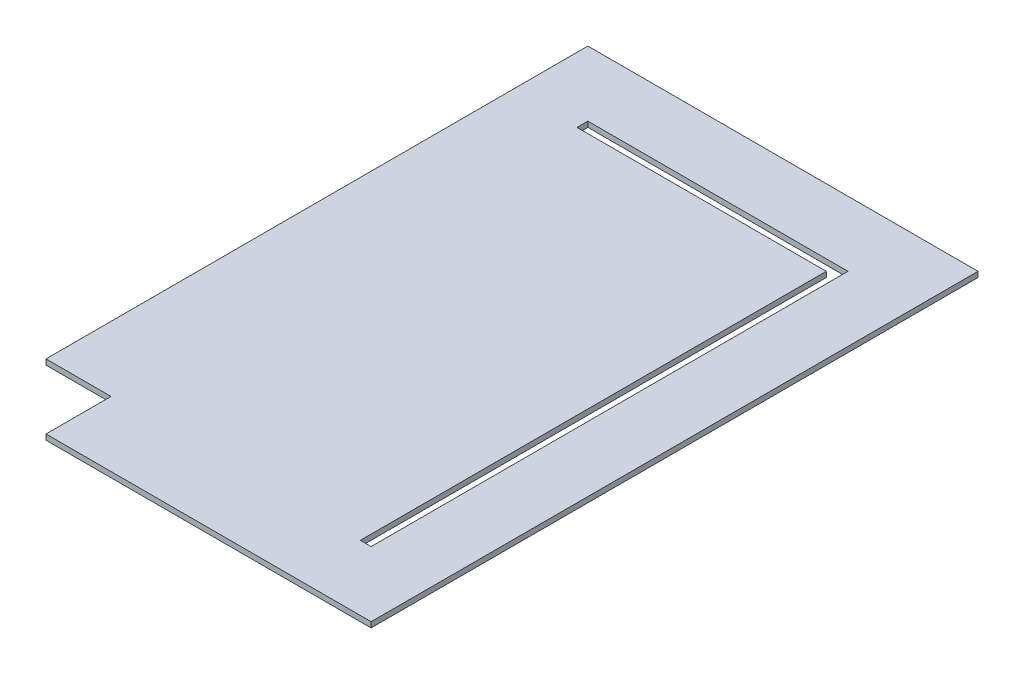
ISO-10303-21;
HEADER;
FILE_DESCRIPTION(('STEP AP214'),'2;1');
FILE_NAME('part.step','',(''),(''),'','','');
FILE_SCHEMA(('AUTOMOTIVE_DESIGN { 1 0 10303 214 1 1 1 1 }'));
ENDSEC;
DATA;
#1=APPLICATION_CONTEXT('core data for automotive mechanical design processes');
#2=APPLICATION_PROTOCOL_DEFINITION('international standard','automotive_design',2000,#1);
#3=PRODUCT_CONTEXT('',#1,'mechanical');
#4=PRODUCT('Part','Part','',(#3));
#5=PRODUCT_RELATED_PRODUCT_CATEGORY('part','',(#4));
#6=PRODUCT_DEFINITION_FORMATION('','',#4);
#7=PRODUCT_DEFINITION_CONTEXT('part definition',#1,'design');
#8=PRODUCT_DEFINITION('design','',#6,#7);
#9=PRODUCT_DEFINITION_SHAPE('','',#8);
#10=(LENGTH_UNIT() NAMED_UNIT(*) SI_UNIT(.MILLI.,.METRE.));
#11=(NAMED_UNIT(*) PLANE_ANGLE_UNIT() SI_UNIT($,.RADIAN.));
#12=(NAMED_UNIT(*) SI_UNIT($,.STERADIAN.) SOLID_ANGLE_UNIT());
#13=UNCERTAINTY_MEASURE_WITH_UNIT(LENGTH_MEASURE(1.E-05),#10,'distance_accuracy_value','');
#14=(GEOMETRIC_REPRESENTATION_CONTEXT(3) GLOBAL_UNCERTAINTY_ASSIGNED_CONTEXT((#13)) GLOBAL_UNIT_ASSIGNED_CONTEXT((#10,
#11,#12)) REPRESENTATION_CONTEXT('',''));
#15=CARTESIAN_POINT('',(0.,0.,0.));
#16=DIRECTION('',(0.,0.,1.));
#17=DIRECTION('',(1.,0.,0.));
#18=AXIS2_PLACEMENT_3D('',#15,#16,#17);
#19=CARTESIAN_POINT('',(0.,3.175,0.));
#20=DIRECTION('',(0.,-1.,0.));
#21=DIRECTION('',(0.,0.,-1.));
#22=AXIS2_PLACEMENT_3D('',#19,#20,#21);
#23=PLANE('',#22);
#24=DIRECTION('',(0.,0.,1.));
#25=VECTOR('',#24,1.);
#26=CARTESIAN_POINT('',(-114.3,3.175,177.8));
#27=LINE('',#26,#25);
#28=CARTESIAN_POINT('',(-114.3,3.175,-177.8));
#29=VERTEX_POINT('',#28);
#30=CARTESIAN_POINT('',(-114.3,3.175,139.7));
#31=VERTEX_POINT('',#30);
#32=EDGE_CURVE('E230',#29,#31,#27,.T.);
#33=ORIENTED_EDGE('',*,*,#32,.T.);
#34=DIRECTION('',(-1.,0.,0.));
#35=VECTOR('',#34,1.);
#36=CARTESIAN_POINT('',(-114.3,3.175,139.7));
#37=LINE('',#36,#35);
#38=CARTESIAN_POINT('',(-76.2,3.175,139.7));
#39=VERTEX_POINT('',#38);
#40=EDGE_CURVE('E173',#39,#31,#37,.T.);
#41=ORIENTED_EDGE('',*,*,#40,.F.);
#42=DIRECTION('',(0.,0.,-1.));
#43=VECTOR('',#42,1.);
#44=CARTESIAN_POINT('',(-76.2,3.175,177.8));
#45=LINE('',#44,#43);
#46=CARTESIAN_POINT('',(-76.2,3.175,177.8));
#47=VERTEX_POINT('',#46);
#48=EDGE_CURVE('E154',#47,#39,#45,.T.);
#49=ORIENTED_EDGE('',*,*,#48,.F.);
#50=DIRECTION('',(1.,0.,0.));
#51=VECTOR('',#50,1.);
#52=CARTESIAN_POINT('',(-114.3,3.175,177.8));
#53=LINE('',#52,#51);
#54=CARTESIAN_POINT('',(114.3,3.175,177.8));
#55=VERTEX_POINT('',#54);
#56=EDGE_CURVE('E233',#47,#55,#53,.T.);
#57=ORIENTED_EDGE('',*,*,#56,.T.);
#58=DIRECTION('',(0.,0.,-1.));
#59=VECTOR('',#58,1.);
#60=CARTESIAN_POINT('',(114.3,3.175,177.8));
#61=LINE('',#60,#59);
#62=CARTESIAN_POINT('',(114.3,3.175,-177.8));
#63=VERTEX_POINT('',#62);
#64=EDGE_CURVE('E225',#55,#63,#61,.T.);
#65=ORIENTED_EDGE('',*,*,#64,.T.);
#66=DIRECTION('',(-1.,0.,0.));
#67=VECTOR('',#66,1.);
#68=CARTESIAN_POINT('',(-114.3,3.175,-177.8));
#69=LINE('',#68,#67);
#70=EDGE_CURVE('E228',#63,#29,#69,.T.);
#71=ORIENTED_EDGE('',*,*,#70,.T.);
#72=EDGE_LOOP('',(#33,#41,#49,#57,#65,#71));
#73=FACE_BOUND('',#72,.T.);
#74=DIRECTION('',(1.,0.,0.));
#75=VECTOR('',#74,1.);
#76=CARTESIAN_POINT('',(-76.2,3.175,-139.7));
#77=LINE('',#76,#75);
#78=CARTESIAN_POINT('',(-76.2,3.175,-139.7));
#79=VERTEX_POINT('',#78);
#80=CARTESIAN_POINT('',(76.2,3.175,-139.7));
#81=VERTEX_POINT('',#80);
#82=EDGE_CURVE('E198',#79,#81,#77,.T.);
#83=ORIENTED_EDGE('',*,*,#82,.T.);
#84=DIRECTION('',(0.,0.,1.));
#85=VECTOR('',#84,1.);
#86=CARTESIAN_POINT('',(76.2,3.175,-139.7));
#87=LINE('',#86,#85);
#88=CARTESIAN_POINT('',(76.2000000000001,3.175,139.7));
#89=VERTEX_POINT('',#88);
#90=EDGE_CURVE('E194',#81,#89,#87,.T.);
#91=ORIENTED_EDGE('',*,*,#90,.T.);
#92=DIRECTION('',(-1.,0.,0.));
#93=VECTOR('',#92,1.);
#94=CARTESIAN_POINT('',(76.2000000000001,3.175,139.7));
#95=LINE('',#94,#93);
#96=CARTESIAN_POINT('',(69.85,3.175,139.7));
#97=VERTEX_POINT('',#96);
#98=EDGE_CURVE('E178',#89,#97,#95,.T.);
#99=ORIENTED_EDGE('',*,*,#98,.T.);
#100=DIRECTION('',(0.,0.,1.));
#101=VECTOR('',#100,1.);
#102=CARTESIAN_POINT('',(69.85,3.175,-133.35));
#103=LINE('',#102,#101);
#104=CARTESIAN_POINT('',(69.85,3.175,-133.35));
#105=VERTEX_POINT('',#104);
#106=EDGE_CURVE('E213',#105,#97,#103,.T.);
#107=ORIENTED_EDGE('',*,*,#106,.F.);
#108=DIRECTION('',(1.,0.,0.));
#109=VECTOR('',#108,1.);
#110=CARTESIAN_POINT('',(-76.2,3.175,-133.35));
#111=LINE('',#110,#109);
#112=CARTESIAN_POINT('',(-76.2,3.175,-133.35));
#113=VERTEX_POINT('',#112);
#114=EDGE_CURVE('E86',#113,#105,#111,.T.);
#115=ORIENTED_EDGE('',*,*,#114,.F.);
#116=DIRECTION('',(0.,0.,1.));
#117=VECTOR('',#116,1.);
#118=CARTESIAN_POINT('',(-76.2,3.175,-139.7));
#119=LINE('',#118,#117);
#120=EDGE_CURVE('E185',#79,#113,#119,.T.);
#121=ORIENTED_EDGE('',*,*,#120,.F.);
#122=EDGE_LOOP('',(#83,#91,#99,#107,#115,#121));
#123=FACE_BOUND('',#122,.T.);
#124=ADVANCED_FACE('F63',(#73,#123),#23,.F.);
#125=CARTESIAN_POINT('',(0.,0.,0.));
#126=DIRECTION('',(0.,-1.,0.));
#127=DIRECTION('',(0.,0.,-1.));
#128=AXIS2_PLACEMENT_3D('',#125,#126,#127);
#129=PLANE('',#128);
#130=DIRECTION('',(-1.,0.,0.));
#131=VECTOR('',#130,1.);
#132=CARTESIAN_POINT('',(-114.3,0.,139.7));
#133=LINE('',#132,#131);
#134=CARTESIAN_POINT('',(-76.2,0.,139.7));
#135=VERTEX_POINT('',#134);
#136=CARTESIAN_POINT('',(-114.3,0.,139.7));
#137=VERTEX_POINT('',#136);
#138=EDGE_CURVE('E161',#135,#137,#133,.T.);
#139=ORIENTED_EDGE('',*,*,#138,.T.);
#140=DIRECTION('',(0.,0.,1.));
#141=VECTOR('',#140,1.);
#142=CARTESIAN_POINT('',(-114.3,0.,177.8));
#143=LINE('',#142,#141);
#144=CARTESIAN_POINT('',(-114.3,0.,-177.8));
#145=VERTEX_POINT('',#144);
#146=EDGE_CURVE('E240',#145,#137,#143,.T.);
#147=ORIENTED_EDGE('',*,*,#146,.F.);
#148=DIRECTION('',(-1.,0.,0.));
#149=VECTOR('',#148,1.);
#150=CARTESIAN_POINT('',(-114.3,0.,-177.8));
#151=LINE('',#150,#149);
#152=CARTESIAN_POINT('',(114.3,0.,-177.8));
#153=VERTEX_POINT('',#152);
#154=EDGE_CURVE('E238',#153,#145,#151,.T.);
#155=ORIENTED_EDGE('',*,*,#154,.F.);
#156=DIRECTION('',(0.,0.,-1.));
#157=VECTOR('',#156,1.);
#158=CARTESIAN_POINT('',(114.3,0.,177.8));
#159=LINE('',#158,#157);
#160=CARTESIAN_POINT('',(114.3,0.,177.8));
#161=VERTEX_POINT('',#160);
#162=EDGE_CURVE('E223',#161,#153,#159,.T.);
#163=ORIENTED_EDGE('',*,*,#162,.F.);
#164=DIRECTION('',(1.,0.,0.));
#165=VECTOR('',#164,1.);
#166=CARTESIAN_POINT('',(-114.3,0.,177.8));
#167=LINE('',#166,#165);
#168=CARTESIAN_POINT('',(-76.2,0.,177.8));
#169=VERTEX_POINT('',#168);
#170=EDGE_CURVE('E172',#169,#161,#167,.T.);
#171=ORIENTED_EDGE('',*,*,#170,.F.);
#172=DIRECTION('',(0.,0.,-1.));
#173=VECTOR('',#172,1.);
#174=CARTESIAN_POINT('',(-76.2,0.,177.8));
#175=LINE('',#174,#173);
#176=EDGE_CURVE('E78',#169,#135,#175,.T.);
#177=ORIENTED_EDGE('',*,*,#176,.T.);
#178=EDGE_LOOP('',(#139,#147,#155,#163,#171,#177));
#179=FACE_BOUND('',#178,.T.);
#180=DIRECTION('',(0.,0.,1.));
#181=VECTOR('',#180,1.);
#182=CARTESIAN_POINT('',(76.2,0.,-139.7));
#183=LINE('',#182,#181);
#184=CARTESIAN_POINT('',(76.2,0.,-139.7));
#185=VERTEX_POINT('',#184);
#186=CARTESIAN_POINT('',(76.2000000000001,0.,139.7));
#187=VERTEX_POINT('',#186);
#188=EDGE_CURVE('E184',#185,#187,#183,.T.);
#189=ORIENTED_EDGE('',*,*,#188,.F.);
#190=DIRECTION('',(1.,0.,0.));
#191=VECTOR('',#190,1.);
#192=CARTESIAN_POINT('',(-76.2,0.,-139.7));
#193=LINE('',#192,#191);
#194=CARTESIAN_POINT('',(-76.2,0.,-139.7));
#195=VERTEX_POINT('',#194);
#196=EDGE_CURVE('E187',#195,#185,#193,.T.);
#197=ORIENTED_EDGE('',*,*,#196,.F.);
#198=DIRECTION('',(0.,0.,1.));
#199=VECTOR('',#198,1.);
#200=CARTESIAN_POINT('',(-76.2,0.,-139.7));
#201=LINE('',#200,#199);
#202=CARTESIAN_POINT('',(-76.2,0.,-133.35));
#203=VERTEX_POINT('',#202);
#204=EDGE_CURVE('E189',#195,#203,#201,.T.);
#205=ORIENTED_EDGE('',*,*,#204,.T.);
#206=DIRECTION('',(1.,0.,0.));
#207=VECTOR('',#206,1.);
#208=CARTESIAN_POINT('',(-76.2,0.,-133.35));
#209=LINE('',#208,#207);
#210=CARTESIAN_POINT('',(69.8499999999999,0.,-133.35));
#211=VERTEX_POINT('',#210);
#212=EDGE_CURVE('E181',#203,#211,#209,.T.);
#213=ORIENTED_EDGE('',*,*,#212,.T.);
#214=DIRECTION('',(0.,0.,1.));
#215=VECTOR('',#214,1.);
#216=CARTESIAN_POINT('',(69.85,0.,-133.35));
#217=LINE('',#216,#215);
#218=CARTESIAN_POINT('',(69.85,0.,139.7));
#219=VERTEX_POINT('',#218);
#220=EDGE_CURVE('E212',#211,#219,#217,.T.);
#221=ORIENTED_EDGE('',*,*,#220,.T.);
#222=DIRECTION('',(-1.,0.,0.));
#223=VECTOR('',#222,1.);
#224=CARTESIAN_POINT('',(76.2000000000001,0.,139.7));
#225=LINE('',#224,#223);
#226=EDGE_CURVE('E209',#187,#219,#225,.T.);
#227=ORIENTED_EDGE('',*,*,#226,.F.);
#228=EDGE_LOOP('',(#189,#197,#205,#213,#221,#227));
#229=FACE_BOUND('',#228,.T.);
#230=ADVANCED_FACE('F169',(#179,#229),#129,.T.);
#231=CARTESIAN_POINT('',(114.3,3.175,177.8));
#232=DIRECTION('',(-1.,0.,0.));
#233=DIRECTION('',(0.,0.,1.));
#234=AXIS2_PLACEMENT_3D('',#231,#232,#233);
#235=PLANE('',#234);
#236=ORIENTED_EDGE('',*,*,#162,.T.);
#237=DIRECTION('',(0.,-1.,0.));
#238=VECTOR('',#237,1.);
#239=CARTESIAN_POINT('',(114.3,3.175,-177.8));
#240=LINE('',#239,#238);
#241=EDGE_CURVE('E12',#63,#153,#240,.T.);
#242=ORIENTED_EDGE('',*,*,#241,.F.);
#243=ORIENTED_EDGE('',*,*,#64,.F.);
#244=DIRECTION('',(0.,-1.,0.));
#245=VECTOR('',#244,1.);
#246=CARTESIAN_POINT('',(114.3,3.175,177.8));
#247=LINE('',#246,#245);
#248=EDGE_CURVE('E235',#55,#161,#247,.T.);
#249=ORIENTED_EDGE('',*,*,#248,.T.);
#250=EDGE_LOOP('',(#236,#242,#243,#249));
#251=FACE_BOUND('',#250,.T.);
#252=ADVANCED_FACE('F65',(#251),#235,.F.);
#253=CARTESIAN_POINT('',(-114.3,3.175,-177.8));
#254=DIRECTION('',(0.,0.,1.));
#255=DIRECTION('',(1.,0.,0.));
#256=AXIS2_PLACEMENT_3D('',#253,#254,#255);
#257=PLANE('',#256);
#258=ORIENTED_EDGE('',*,*,#154,.T.);
#259=DIRECTION('',(0.,-1.,0.));
#260=VECTOR('',#259,1.);
#261=CARTESIAN_POINT('',(-114.3,3.175,-177.8));
#262=LINE('',#261,#260);
#263=EDGE_CURVE('E71',#29,#145,#262,.T.);
#264=ORIENTED_EDGE('',*,*,#263,.F.);
#265=ORIENTED_EDGE('',*,*,#70,.F.);
#266=ORIENTED_EDGE('',*,*,#241,.T.);
#267=EDGE_LOOP('',(#258,#264,#265,#266));
#268=FACE_BOUND('',#267,.T.);
#269=ADVANCED_FACE('F251',(#268),#257,.F.);
#270=CARTESIAN_POINT('',(-114.3,3.175,177.8));
#271=DIRECTION('',(1.,0.,0.));
#272=DIRECTION('',(0.,0.,-1.));
#273=AXIS2_PLACEMENT_3D('',#270,#271,#272);
#274=PLANE('',#273);
#275=ORIENTED_EDGE('',*,*,#146,.T.);
#276=DIRECTION('',(0.,1.,0.));
#277=VECTOR('',#276,1.);
#278=CARTESIAN_POINT('',(-114.3,0.,139.7));
#279=LINE('',#278,#277);
#280=EDGE_CURVE('E157',#137,#31,#279,.T.);
#281=ORIENTED_EDGE('',*,*,#280,.T.);
#282=ORIENTED_EDGE('',*,*,#32,.F.);
#283=ORIENTED_EDGE('',*,*,#263,.T.);
#284=EDGE_LOOP('',(#275,#281,#282,#283));
#285=FACE_BOUND('',#284,.T.);
#286=ADVANCED_FACE('F248',(#285),#274,.F.);
#287=CARTESIAN_POINT('',(-114.3,3.175,177.8));
#288=DIRECTION('',(0.,0.,-1.));
#289=DIRECTION('',(-1.,0.,0.));
#290=AXIS2_PLACEMENT_3D('',#287,#288,#289);
#291=PLANE('',#290);
#292=ORIENTED_EDGE('',*,*,#56,.F.);
#293=DIRECTION('',(0.,1.,0.));
#294=VECTOR('',#293,1.);
#295=CARTESIAN_POINT('',(-76.2,0.,177.8));
#296=LINE('',#295,#294);
#297=EDGE_CURVE('E158',#169,#47,#296,.T.);
#298=ORIENTED_EDGE('',*,*,#297,.F.);
#299=ORIENTED_EDGE('',*,*,#170,.T.);
#300=ORIENTED_EDGE('',*,*,#248,.F.);
#301=EDGE_LOOP('',(#292,#298,#299,#300));
#302=FACE_BOUND('',#301,.T.);
#303=ADVANCED_FACE('F257',(#302),#291,.F.);
#304=CARTESIAN_POINT('',(-76.2,0.,-139.7));
#305=DIRECTION('',(0.,0.,1.));
#306=DIRECTION('',(1.,0.,0.));
#307=AXIS2_PLACEMENT_3D('',#304,#305,#306);
#308=PLANE('',#307);
#309=ORIENTED_EDGE('',*,*,#82,.F.);
#310=DIRECTION('',(0.,1.,0.));
#311=VECTOR('',#310,1.);
#312=CARTESIAN_POINT('',(-76.2,0.,-139.7));
#313=LINE('',#312,#311);
#314=EDGE_CURVE('E206',#195,#79,#313,.T.);
#315=ORIENTED_EDGE('',*,*,#314,.F.);
#316=ORIENTED_EDGE('',*,*,#196,.T.);
#317=DIRECTION('',(0.,1.,0.));
#318=VECTOR('',#317,1.);
#319=CARTESIAN_POINT('',(76.2,0.,-139.7));
#320=LINE('',#319,#318);
#321=EDGE_CURVE('E192',#185,#81,#320,.T.);
#322=ORIENTED_EDGE('',*,*,#321,.T.);
#323=EDGE_LOOP('',(#309,#315,#316,#322));
#324=FACE_BOUND('',#323,.T.);
#325=ADVANCED_FACE('F266',(#324),#308,.T.);
#326=CARTESIAN_POINT('',(-76.2,0.,-139.7));
#327=DIRECTION('',(-1.,0.,0.));
#328=DIRECTION('',(0.,0.,1.));
#329=AXIS2_PLACEMENT_3D('',#326,#327,#328);
#330=PLANE('',#329);
#331=ORIENTED_EDGE('',*,*,#120,.T.);
#332=DIRECTION('',(0.,1.,0.));
#333=VECTOR('',#332,1.);
#334=CARTESIAN_POINT('',(-76.2,0.,-133.35));
#335=LINE('',#334,#333);
#336=EDGE_CURVE('E203',#203,#113,#335,.T.);
#337=ORIENTED_EDGE('',*,*,#336,.F.);
#338=ORIENTED_EDGE('',*,*,#204,.F.);
#339=ORIENTED_EDGE('',*,*,#314,.T.);
#340=EDGE_LOOP('',(#331,#337,#338,#339));
#341=FACE_BOUND('',#340,.T.);
#342=ADVANCED_FACE('F285',(#341),#330,.F.);
#343=CARTESIAN_POINT('',(-76.2,0.,-133.35));
#344=DIRECTION('',(0.,0.,1.));
#345=DIRECTION('',(1.,0.,0.));
#346=AXIS2_PLACEMENT_3D('',#343,#344,#345);
#347=PLANE('',#346);
#348=ORIENTED_EDGE('',*,*,#212,.F.);
#349=ORIENTED_EDGE('',*,*,#336,.T.);
#350=ORIENTED_EDGE('',*,*,#114,.T.);
#351=DIRECTION('',(0.,1.,0.));
#352=VECTOR('',#351,1.);
#353=CARTESIAN_POINT('',(69.85,0.,-133.35));
#354=LINE('',#353,#352);
#355=EDGE_CURVE('E205',#211,#105,#354,.T.);
#356=ORIENTED_EDGE('',*,*,#355,.F.);
#357=EDGE_LOOP('',(#348,#349,#350,#356));
#358=FACE_BOUND('',#357,.T.);
#359=ADVANCED_FACE('F283',(#358),#347,.F.);
#360=CARTESIAN_POINT('',(76.2,0.,-139.7));
#361=DIRECTION('',(-1.,0.,0.));
#362=DIRECTION('',(0.,0.,1.));
#363=AXIS2_PLACEMENT_3D('',#360,#361,#362);
#364=PLANE('',#363);
#365=ORIENTED_EDGE('',*,*,#90,.F.);
#366=ORIENTED_EDGE('',*,*,#321,.F.);
#367=ORIENTED_EDGE('',*,*,#188,.T.);
#368=DIRECTION('',(0.,1.,0.));
#369=VECTOR('',#368,1.);
#370=CARTESIAN_POINT('',(76.2000000000001,0.,139.7));
#371=LINE('',#370,#369);
#372=EDGE_CURVE('E216',#187,#89,#371,.T.);
#373=ORIENTED_EDGE('',*,*,#372,.T.);
#374=EDGE_LOOP('',(#365,#366,#367,#373));
#375=FACE_BOUND('',#374,.T.);
#376=ADVANCED_FACE('F272',(#375),#364,.T.);
#377=CARTESIAN_POINT('',(76.2000000000001,0.,139.7));
#378=DIRECTION('',(0.,0.,-1.));
#379=DIRECTION('',(-1.,0.,0.));
#380=AXIS2_PLACEMENT_3D('',#377,#378,#379);
#381=PLANE('',#380);
#382=ORIENTED_EDGE('',*,*,#98,.F.);
#383=ORIENTED_EDGE('',*,*,#372,.F.);
#384=ORIENTED_EDGE('',*,*,#226,.T.);
#385=DIRECTION('',(0.,1.,0.));
#386=VECTOR('',#385,1.);
#387=CARTESIAN_POINT('',(69.85,0.,139.7));
#388=LINE('',#387,#386);
#389=EDGE_CURVE('E195',#219,#97,#388,.T.);
#390=ORIENTED_EDGE('',*,*,#389,.T.);
#391=EDGE_LOOP('',(#382,#383,#384,#390));
#392=FACE_BOUND('',#391,.T.);
#393=ADVANCED_FACE('F277',(#392),#381,.T.);
#394=CARTESIAN_POINT('',(69.85,0.,-133.35));
#395=DIRECTION('',(-1.,0.,0.));
#396=DIRECTION('',(0.,0.,1.));
#397=AXIS2_PLACEMENT_3D('',#394,#395,#396);
#398=PLANE('',#397);
#399=ORIENTED_EDGE('',*,*,#106,.T.);
#400=ORIENTED_EDGE('',*,*,#389,.F.);
#401=ORIENTED_EDGE('',*,*,#220,.F.);
#402=ORIENTED_EDGE('',*,*,#355,.T.);
#403=EDGE_LOOP('',(#399,#400,#401,#402));
#404=FACE_BOUND('',#403,.T.);
#405=ADVANCED_FACE('F280',(#404),#398,.F.);
#406=CARTESIAN_POINT('',(-114.3,0.,139.7));
#407=DIRECTION('',(0.,0.,-1.));
#408=DIRECTION('',(-1.,0.,0.));
#409=AXIS2_PLACEMENT_3D('',#406,#407,#408);
#410=PLANE('',#409);
#411=ORIENTED_EDGE('',*,*,#40,.T.);
#412=ORIENTED_EDGE('',*,*,#280,.F.);
#413=ORIENTED_EDGE('',*,*,#138,.F.);
#414=DIRECTION('',(0.,1.,0.));
#415=VECTOR('',#414,1.);
#416=CARTESIAN_POINT('',(-76.2,0.,139.7));
#417=LINE('',#416,#415);
#418=EDGE_CURVE('E150',#135,#39,#417,.T.);
#419=ORIENTED_EDGE('',*,*,#418,.T.);
#420=EDGE_LOOP('',(#411,#412,#413,#419));
#421=FACE_BOUND('',#420,.T.);
#422=ADVANCED_FACE('F162',(#421),#410,.F.);
#423=CARTESIAN_POINT('',(-76.2,0.,177.8));
#424=DIRECTION('',(1.,0.,0.));
#425=DIRECTION('',(0.,0.,-1.));
#426=AXIS2_PLACEMENT_3D('',#423,#424,#425);
#427=PLANE('',#426);
#428=ORIENTED_EDGE('',*,*,#48,.T.);
#429=ORIENTED_EDGE('',*,*,#418,.F.);
#430=ORIENTED_EDGE('',*,*,#176,.F.);
#431=ORIENTED_EDGE('',*,*,#297,.T.);
#432=EDGE_LOOP('',(#428,#429,#430,#431));
#433=FACE_BOUND('',#432,.T.);
#434=ADVANCED_FACE('F152',(#433),#427,.F.);
#435=CLOSED_SHELL('',(#124,#230,#252,#269,#286,#303,#325,#342,#359,#376,#393,#405,#422,#434));
#436=MANIFOLD_SOLID_BREP('B2',#435);
#437=ADVANCED_BREP_SHAPE_REPRESENTATION('',(#18,#436),#14);
#438=SHAPE_DEFINITION_REPRESENTATION(#9,#437);
ENDSEC;
END-ISO-10303-21;
